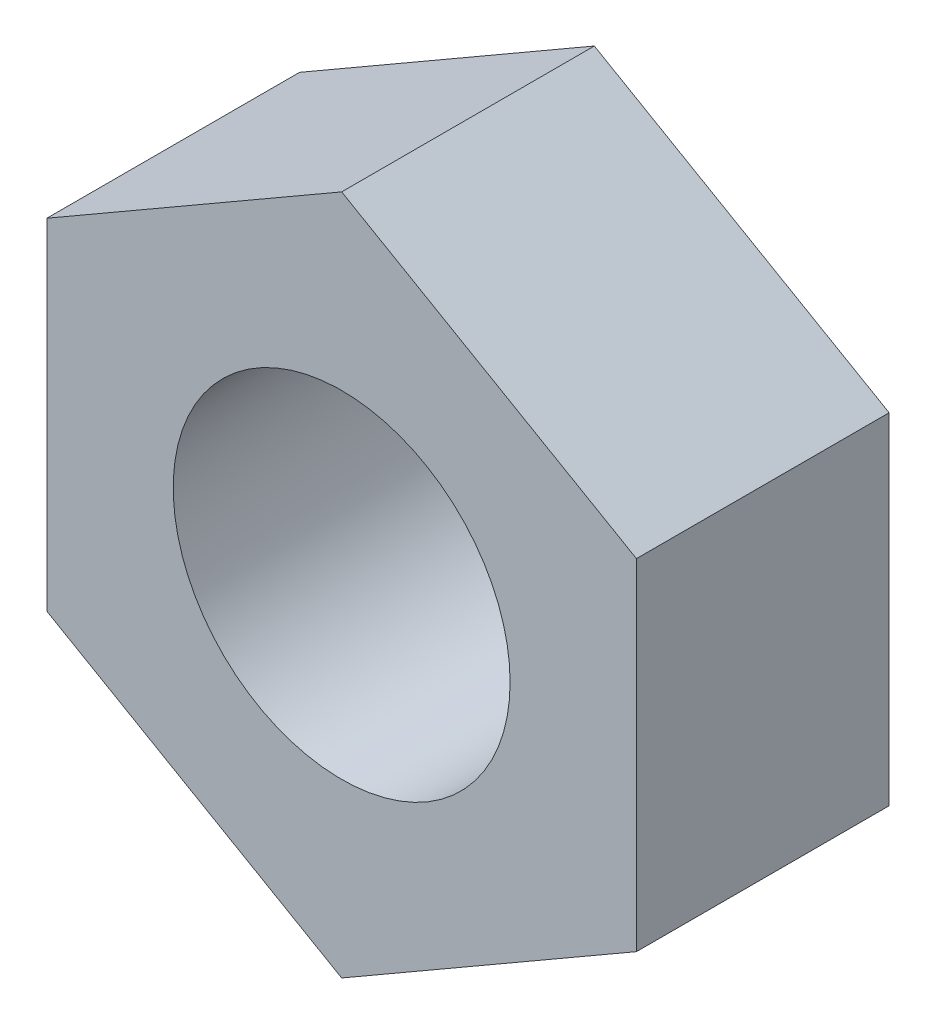
ISO-10303-21;
HEADER;
FILE_DESCRIPTION(('STEP AP214'),'2;1');
FILE_NAME('part.step','',(''),(''),'','','');
FILE_SCHEMA(('AUTOMOTIVE_DESIGN { 1 0 10303 214 1 1 1 1 }'));
ENDSEC;
DATA;
#1=APPLICATION_CONTEXT('core data for automotive mechanical design processes');
#2=APPLICATION_PROTOCOL_DEFINITION('international standard','automotive_design',2000,#1);
#3=PRODUCT_CONTEXT('',#1,'mechanical');
#4=PRODUCT('Part','Part','',(#3));
#5=PRODUCT_RELATED_PRODUCT_CATEGORY('part','',(#4));
#6=PRODUCT_DEFINITION_FORMATION('','',#4);
#7=PRODUCT_DEFINITION_CONTEXT('part definition',#1,'design');
#8=PRODUCT_DEFINITION('design','',#6,#7);
#9=PRODUCT_DEFINITION_SHAPE('','',#8);
#10=(LENGTH_UNIT() NAMED_UNIT(*) SI_UNIT(.MILLI.,.METRE.));
#11=(NAMED_UNIT(*) PLANE_ANGLE_UNIT() SI_UNIT($,.RADIAN.));
#12=(NAMED_UNIT(*) SI_UNIT($,.STERADIAN.) SOLID_ANGLE_UNIT());
#13=UNCERTAINTY_MEASURE_WITH_UNIT(LENGTH_MEASURE(1.E-05),#10,'distance_accuracy_value','');
#14=(GEOMETRIC_REPRESENTATION_CONTEXT(3) GLOBAL_UNCERTAINTY_ASSIGNED_CONTEXT((#13)) GLOBAL_UNIT_ASSIGNED_CONTEXT((#10,
#11,#12)) REPRESENTATION_CONTEXT('',''));
#15=CARTESIAN_POINT('',(0.,0.,0.));
#16=DIRECTION('',(0.,0.,1.));
#17=DIRECTION('',(1.,0.,0.));
#18=AXIS2_PLACEMENT_3D('',#15,#16,#17);
#19=CARTESIAN_POINT('',(0.,0.,3.));
#20=DIRECTION('',(0.,0.,1.));
#21=DIRECTION('',(1.,0.,0.));
#22=AXIS2_PLACEMENT_3D('',#19,#20,#21);
#23=PLANE('',#22);
#24=DIRECTION('',(-0.866025403784442,0.499999999999995,0.));
#25=VECTOR('',#24,1.);
#26=CARTESIAN_POINT('',(3.49999999999997,2.02072594216373,3.));
#27=LINE('',#26,#25);
#28=CARTESIAN_POINT('',(3.49999999999997,2.02072594216373,3.));
#29=VERTEX_POINT('',#28);
#30=CARTESIAN_POINT('',(0.,4.04145188432738,3.));
#31=VERTEX_POINT('',#30);
#32=EDGE_CURVE('E131',#29,#31,#27,.T.);
#33=ORIENTED_EDGE('',*,*,#32,.T.);
#34=DIRECTION('',(-0.866025403784438,-0.500000000000001,0.));
#35=VECTOR('',#34,1.);
#36=CARTESIAN_POINT('',(0.,4.04145188432738,3.));
#37=LINE('',#36,#35);
#38=CARTESIAN_POINT('',(-3.5,2.02072594216368,3.));
#39=VERTEX_POINT('',#38);
#40=EDGE_CURVE('E89',#31,#39,#37,.T.);
#41=ORIENTED_EDGE('',*,*,#40,.T.);
#42=DIRECTION('',(0.,-1.,0.));
#43=VECTOR('',#42,1.);
#44=CARTESIAN_POINT('',(-3.5,2.02072594216368,3.));
#45=LINE('',#44,#43);
#46=CARTESIAN_POINT('',(-3.49999999999999,-2.0207259421637,3.));
#47=VERTEX_POINT('',#46);
#48=EDGE_CURVE('E102',#39,#47,#45,.T.);
#49=ORIENTED_EDGE('',*,*,#48,.T.);
#50=DIRECTION('',(0.866025403784442,-0.499999999999995,0.));
#51=VECTOR('',#50,1.);
#52=CARTESIAN_POINT('',(-3.49999999999999,-2.0207259421637,3.));
#53=LINE('',#52,#51);
#54=CARTESIAN_POINT('',(0.,-4.04145188432738,3.));
#55=VERTEX_POINT('',#54);
#56=EDGE_CURVE('E96',#47,#55,#53,.T.);
#57=ORIENTED_EDGE('',*,*,#56,.T.);
#58=DIRECTION('',(0.866025403784434,0.500000000000007,0.));
#59=VECTOR('',#58,1.);
#60=CARTESIAN_POINT('',(0.,-4.04145188432738,3.));
#61=LINE('',#60,#59);
#62=CARTESIAN_POINT('',(3.50000000000001,-2.02072594216365,3.));
#63=VERTEX_POINT('',#62);
#64=EDGE_CURVE('E100',#55,#63,#61,.T.);
#65=ORIENTED_EDGE('',*,*,#64,.T.);
#66=DIRECTION('',(0.,1.,0.));
#67=VECTOR('',#66,1.);
#68=CARTESIAN_POINT('',(3.50000000000001,-2.02072594216365,3.));
#69=LINE('',#68,#67);
#70=EDGE_CURVE('E52',#63,#29,#69,.T.);
#71=ORIENTED_EDGE('',*,*,#70,.T.);
#72=EDGE_LOOP('',(#33,#41,#49,#57,#65,#71));
#73=FACE_BOUND('',#72,.T.);
#74=CARTESIAN_POINT('',(0.,0.,3.));
#75=DIRECTION('',(0.,0.,1.));
#76=DIRECTION('',(1.,0.,0.));
#77=AXIS2_PLACEMENT_3D('',#74,#75,#76);
#78=CIRCLE('',#77,2.);
#79=CARTESIAN_POINT('',(2.,0.,3.));
#80=VERTEX_POINT('',#79);
#81=EDGE_CURVE('E124',#80,#80,#78,.T.);
#82=ORIENTED_EDGE('',*,*,#81,.F.);
#83=EDGE_LOOP('',(#82));
#84=FACE_BOUND('',#83,.T.);
#85=ADVANCED_FACE('F35',(#73,#84),#23,.T.);
#86=CARTESIAN_POINT('',(0.,0.,0.));
#87=DIRECTION('',(0.,0.,1.));
#88=DIRECTION('',(1.,0.,0.));
#89=AXIS2_PLACEMENT_3D('',#86,#87,#88);
#90=PLANE('',#89);
#91=DIRECTION('',(-0.866025403784442,0.499999999999995,0.));
#92=VECTOR('',#91,1.);
#93=CARTESIAN_POINT('',(3.49999999999997,2.02072594216373,0.));
#94=LINE('',#93,#92);
#95=CARTESIAN_POINT('',(3.49999999999997,2.02072594216373,0.));
#96=VERTEX_POINT('',#95);
#97=CARTESIAN_POINT('',(0.,4.04145188432738,0.));
#98=VERTEX_POINT('',#97);
#99=EDGE_CURVE('E120',#96,#98,#94,.T.);
#100=ORIENTED_EDGE('',*,*,#99,.F.);
#101=DIRECTION('',(0.,1.,0.));
#102=VECTOR('',#101,1.);
#103=CARTESIAN_POINT('',(3.50000000000001,-2.02072594216365,0.));
#104=LINE('',#103,#102);
#105=CARTESIAN_POINT('',(3.50000000000001,-2.02072594216365,0.));
#106=VERTEX_POINT('',#105);
#107=EDGE_CURVE('E81',#106,#96,#104,.T.);
#108=ORIENTED_EDGE('',*,*,#107,.F.);
#109=DIRECTION('',(0.866025403784434,0.500000000000007,0.));
#110=VECTOR('',#109,1.);
#111=CARTESIAN_POINT('',(0.,-4.04145188432738,0.));
#112=LINE('',#111,#110);
#113=CARTESIAN_POINT('',(0.,-4.04145188432738,0.));
#114=VERTEX_POINT('',#113);
#115=EDGE_CURVE('E75',#114,#106,#112,.T.);
#116=ORIENTED_EDGE('',*,*,#115,.F.);
#117=DIRECTION('',(0.866025403784442,-0.499999999999995,0.));
#118=VECTOR('',#117,1.);
#119=CARTESIAN_POINT('',(-3.49999999999999,-2.0207259421637,0.));
#120=LINE('',#119,#118);
#121=CARTESIAN_POINT('',(-3.49999999999999,-2.0207259421637,0.));
#122=VERTEX_POINT('',#121);
#123=EDGE_CURVE('E110',#122,#114,#120,.T.);
#124=ORIENTED_EDGE('',*,*,#123,.F.);
#125=DIRECTION('',(0.,-1.,0.));
#126=VECTOR('',#125,1.);
#127=CARTESIAN_POINT('',(-3.5,2.02072594216368,0.));
#128=LINE('',#127,#126);
#129=CARTESIAN_POINT('',(-3.5,2.02072594216368,0.));
#130=VERTEX_POINT('',#129);
#131=EDGE_CURVE('E126',#130,#122,#128,.T.);
#132=ORIENTED_EDGE('',*,*,#131,.F.);
#133=DIRECTION('',(-0.866025403784438,-0.500000000000001,0.));
#134=VECTOR('',#133,1.);
#135=CARTESIAN_POINT('',(0.,4.04145188432738,0.));
#136=LINE('',#135,#134);
#137=EDGE_CURVE('E123',#98,#130,#136,.T.);
#138=ORIENTED_EDGE('',*,*,#137,.F.);
#139=EDGE_LOOP('',(#100,#108,#116,#124,#132,#138));
#140=FACE_BOUND('',#139,.T.);
#141=CARTESIAN_POINT('',(0.,0.,0.));
#142=DIRECTION('',(0.,0.,1.));
#143=DIRECTION('',(1.,0.,0.));
#144=AXIS2_PLACEMENT_3D('',#141,#142,#143);
#145=CIRCLE('',#144,2.);
#146=CARTESIAN_POINT('',(2.,0.,0.));
#147=VERTEX_POINT('',#146);
#148=EDGE_CURVE('E224',#147,#147,#145,.T.);
#149=ORIENTED_EDGE('',*,*,#148,.T.);
#150=EDGE_LOOP('',(#149));
#151=FACE_BOUND('',#150,.T.);
#152=ADVANCED_FACE('F140',(#140,#151),#90,.F.);
#153=CARTESIAN_POINT('',(3.49999999999997,2.02072594216373,3.));
#154=DIRECTION('',(-0.499999999999995,-0.866025403784441,0.));
#155=DIRECTION('',(0.866025403784442,-0.499999999999995,0.));
#156=AXIS2_PLACEMENT_3D('',#153,#154,#155);
#157=PLANE('',#156);
#158=ORIENTED_EDGE('',*,*,#99,.T.);
#159=DIRECTION('',(0.,0.,-1.));
#160=VECTOR('',#159,1.);
#161=CARTESIAN_POINT('',(0.,4.04145188432738,3.));
#162=LINE('',#161,#160);
#163=EDGE_CURVE('E11',#31,#98,#162,.T.);
#164=ORIENTED_EDGE('',*,*,#163,.F.);
#165=ORIENTED_EDGE('',*,*,#32,.F.);
#166=DIRECTION('',(0.,0.,-1.));
#167=VECTOR('',#166,1.);
#168=CARTESIAN_POINT('',(3.49999999999997,2.02072594216373,3.));
#169=LINE('',#168,#167);
#170=EDGE_CURVE('E116',#29,#96,#169,.T.);
#171=ORIENTED_EDGE('',*,*,#170,.T.);
#172=EDGE_LOOP('',(#158,#164,#165,#171));
#173=FACE_BOUND('',#172,.T.);
#174=ADVANCED_FACE('F37',(#173),#157,.F.);
#175=CARTESIAN_POINT('',(0.,4.04145188432738,3.));
#176=DIRECTION('',(0.500000000000001,-0.866025403784438,0.));
#177=DIRECTION('',(0.866025403784438,0.500000000000001,0.));
#178=AXIS2_PLACEMENT_3D('',#175,#176,#177);
#179=PLANE('',#178);
#180=ORIENTED_EDGE('',*,*,#137,.T.);
#181=DIRECTION('',(0.,0.,-1.));
#182=VECTOR('',#181,1.);
#183=CARTESIAN_POINT('',(-3.5,2.02072594216368,3.));
#184=LINE('',#183,#182);
#185=EDGE_CURVE('E44',#39,#130,#184,.T.);
#186=ORIENTED_EDGE('',*,*,#185,.F.);
#187=ORIENTED_EDGE('',*,*,#40,.F.);
#188=ORIENTED_EDGE('',*,*,#163,.T.);
#189=EDGE_LOOP('',(#180,#186,#187,#188));
#190=FACE_BOUND('',#189,.T.);
#191=ADVANCED_FACE('F165',(#190),#179,.F.);
#192=CARTESIAN_POINT('',(-3.5,2.02072594216368,3.));
#193=DIRECTION('',(1.,0.,0.));
#194=DIRECTION('',(0.,1.,0.));
#195=AXIS2_PLACEMENT_3D('',#192,#193,#194);
#196=PLANE('',#195);
#197=ORIENTED_EDGE('',*,*,#131,.T.);
#198=DIRECTION('',(0.,0.,-1.));
#199=VECTOR('',#198,1.);
#200=CARTESIAN_POINT('',(-3.49999999999999,-2.0207259421637,3.));
#201=LINE('',#200,#199);
#202=EDGE_CURVE('E111',#47,#122,#201,.T.);
#203=ORIENTED_EDGE('',*,*,#202,.F.);
#204=ORIENTED_EDGE('',*,*,#48,.F.);
#205=ORIENTED_EDGE('',*,*,#185,.T.);
#206=EDGE_LOOP('',(#197,#203,#204,#205));
#207=FACE_BOUND('',#206,.T.);
#208=ADVANCED_FACE('F137',(#207),#196,.F.);
#209=CARTESIAN_POINT('',(-3.49999999999999,-2.0207259421637,3.));
#210=DIRECTION('',(0.499999999999995,0.866025403784441,0.));
#211=DIRECTION('',(-0.866025403784442,0.499999999999995,0.));
#212=AXIS2_PLACEMENT_3D('',#209,#210,#211);
#213=PLANE('',#212);
#214=ORIENTED_EDGE('',*,*,#123,.T.);
#215=DIRECTION('',(0.,0.,-1.));
#216=VECTOR('',#215,1.);
#217=CARTESIAN_POINT('',(0.,-4.04145188432738,3.));
#218=LINE('',#217,#216);
#219=EDGE_CURVE('E107',#55,#114,#218,.T.);
#220=ORIENTED_EDGE('',*,*,#219,.F.);
#221=ORIENTED_EDGE('',*,*,#56,.F.);
#222=ORIENTED_EDGE('',*,*,#202,.T.);
#223=EDGE_LOOP('',(#214,#220,#221,#222));
#224=FACE_BOUND('',#223,.T.);
#225=ADVANCED_FACE('F108',(#224),#213,.F.);
#226=CARTESIAN_POINT('',(0.,-4.04145188432738,3.));
#227=DIRECTION('',(-0.500000000000007,0.866025403784434,0.));
#228=DIRECTION('',(-0.866025403784435,-0.500000000000007,0.));
#229=AXIS2_PLACEMENT_3D('',#226,#227,#228);
#230=PLANE('',#229);
#231=ORIENTED_EDGE('',*,*,#115,.T.);
#232=DIRECTION('',(0.,0.,-1.));
#233=VECTOR('',#232,1.);
#234=CARTESIAN_POINT('',(3.50000000000001,-2.02072594216365,3.));
#235=LINE('',#234,#233);
#236=EDGE_CURVE('E112',#63,#106,#235,.T.);
#237=ORIENTED_EDGE('',*,*,#236,.F.);
#238=ORIENTED_EDGE('',*,*,#64,.F.);
#239=ORIENTED_EDGE('',*,*,#219,.T.);
#240=EDGE_LOOP('',(#231,#237,#238,#239));
#241=FACE_BOUND('',#240,.T.);
#242=ADVANCED_FACE('F114',(#241),#230,.F.);
#243=CARTESIAN_POINT('',(3.50000000000001,-2.02072594216365,3.));
#244=DIRECTION('',(-1.,0.,0.));
#245=DIRECTION('',(0.,-1.,0.));
#246=AXIS2_PLACEMENT_3D('',#243,#244,#245);
#247=PLANE('',#246);
#248=ORIENTED_EDGE('',*,*,#107,.T.);
#249=ORIENTED_EDGE('',*,*,#170,.F.);
#250=ORIENTED_EDGE('',*,*,#70,.F.);
#251=ORIENTED_EDGE('',*,*,#236,.T.);
#252=EDGE_LOOP('',(#248,#249,#250,#251));
#253=FACE_BOUND('',#252,.T.);
#254=ADVANCED_FACE('F145',(#253),#247,.F.);
#255=CARTESIAN_POINT('',(0.,0.,3.));
#256=DIRECTION('',(0.,0.,-1.));
#257=DIRECTION('',(-1.,0.,0.));
#258=AXIS2_PLACEMENT_3D('',#255,#256,#257);
#259=CYLINDRICAL_SURFACE('',#258,2.);
#260=ORIENTED_EDGE('',*,*,#81,.T.);
#261=EDGE_LOOP('',(#260));
#262=FACE_BOUND('',#261,.T.);
#263=ORIENTED_EDGE('',*,*,#148,.F.);
#264=EDGE_LOOP('',(#263));
#265=FACE_BOUND('',#264,.T.);
#266=ADVANCED_FACE('F147',(#262,#265),#259,.F.);
#267=CLOSED_SHELL('',(#85,#152,#174,#191,#208,#225,#242,#254,#266));
#268=MANIFOLD_SOLID_BREP('B2',#267);
#269=ADVANCED_BREP_SHAPE_REPRESENTATION('',(#18,#268),#14);
#270=SHAPE_DEFINITION_REPRESENTATION(#9,#269);
ENDSEC;
END-ISO-10303-21;
